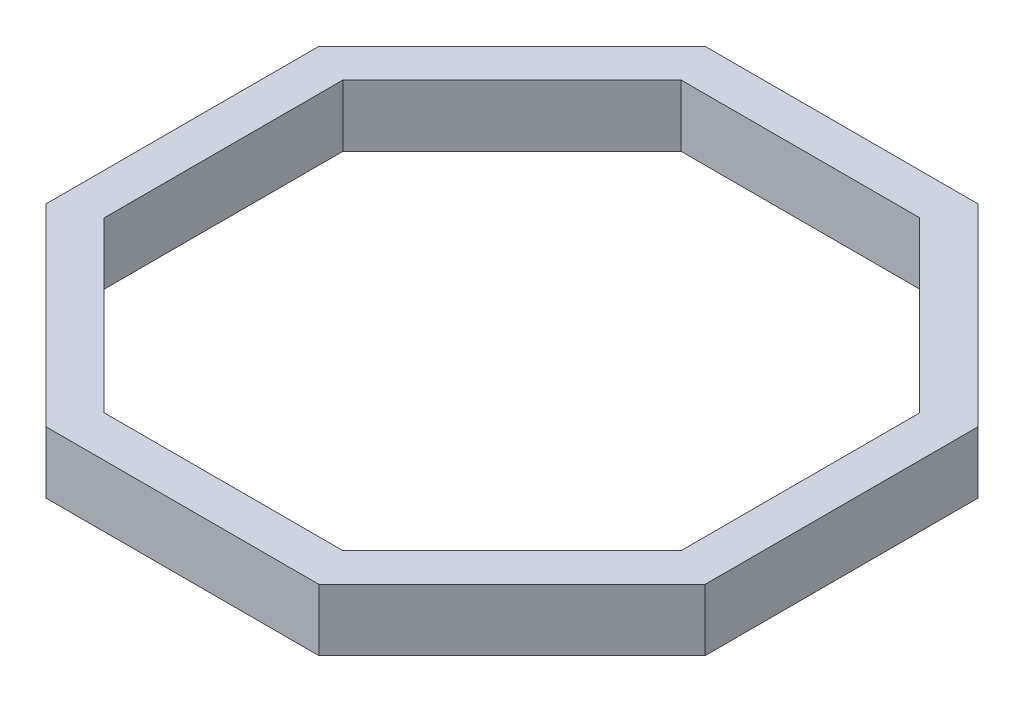
ISO-10303-21;
HEADER;
FILE_DESCRIPTION(('STEP AP214'),'2;1');
FILE_NAME('part.step','',(''),(''),'','','');
FILE_SCHEMA(('AUTOMOTIVE_DESIGN { 1 0 10303 214 1 1 1 1 }'));
ENDSEC;
DATA;
#1=APPLICATION_CONTEXT('core data for automotive mechanical design processes');
#2=APPLICATION_PROTOCOL_DEFINITION('international standard','automotive_design',2000,#1);
#3=PRODUCT_CONTEXT('',#1,'mechanical');
#4=PRODUCT('Part','Part','',(#3));
#5=PRODUCT_RELATED_PRODUCT_CATEGORY('part','',(#4));
#6=PRODUCT_DEFINITION_FORMATION('','',#4);
#7=PRODUCT_DEFINITION_CONTEXT('part definition',#1,'design');
#8=PRODUCT_DEFINITION('design','',#6,#7);
#9=PRODUCT_DEFINITION_SHAPE('','',#8);
#10=(LENGTH_UNIT() NAMED_UNIT(*) SI_UNIT(.MILLI.,.METRE.));
#11=(NAMED_UNIT(*) PLANE_ANGLE_UNIT() SI_UNIT($,.RADIAN.));
#12=(NAMED_UNIT(*) SI_UNIT($,.STERADIAN.) SOLID_ANGLE_UNIT());
#13=UNCERTAINTY_MEASURE_WITH_UNIT(LENGTH_MEASURE(1.E-05),#10,'distance_accuracy_value','');
#14=(GEOMETRIC_REPRESENTATION_CONTEXT(3) GLOBAL_UNCERTAINTY_ASSIGNED_CONTEXT((#13)) GLOBAL_UNIT_ASSIGNED_CONTEXT((#10,
#11,#12)) REPRESENTATION_CONTEXT('',''));
#15=CARTESIAN_POINT('',(0.,0.,0.));
#16=DIRECTION('',(0.,0.,1.));
#17=DIRECTION('',(1.,0.,0.));
#18=AXIS2_PLACEMENT_3D('',#15,#16,#17);
#19=CARTESIAN_POINT('',(160.,30.,66.274169979695));
#20=DIRECTION('',(-1.,0.,0.));
#21=DIRECTION('',(0.,0.,1.));
#22=AXIS2_PLACEMENT_3D('',#19,#20,#21);
#23=PLANE('',#22);
#24=DIRECTION('',(0.,0.,-1.));
#25=VECTOR('',#24,1.);
#26=CARTESIAN_POINT('',(160.,0.,66.274169979695));
#27=LINE('',#26,#25);
#28=CARTESIAN_POINT('',(160.,0.,66.274169979695));
#29=VERTEX_POINT('',#28);
#30=CARTESIAN_POINT('',(160.,0.,-66.2741699796952));
#31=VERTEX_POINT('',#30);
#32=EDGE_CURVE('E204',#29,#31,#27,.T.);
#33=ORIENTED_EDGE('',*,*,#32,.T.);
#34=DIRECTION('',(0.,-1.,0.));
#35=VECTOR('',#34,1.);
#36=CARTESIAN_POINT('',(160.,30.,-66.2741699796952));
#37=LINE('',#36,#35);
#38=CARTESIAN_POINT('',(160.,30.,-66.2741699796952));
#39=VERTEX_POINT('',#38);
#40=EDGE_CURVE('E11',#39,#31,#37,.T.);
#41=ORIENTED_EDGE('',*,*,#40,.F.);
#42=DIRECTION('',(0.,0.,-1.));
#43=VECTOR('',#42,1.);
#44=CARTESIAN_POINT('',(160.,30.,66.274169979695));
#45=LINE('',#44,#43);
#46=CARTESIAN_POINT('',(160.,30.,66.274169979695));
#47=VERTEX_POINT('',#46);
#48=EDGE_CURVE('E216',#47,#39,#45,.T.);
#49=ORIENTED_EDGE('',*,*,#48,.F.);
#50=DIRECTION('',(0.,-1.,0.));
#51=VECTOR('',#50,1.);
#52=CARTESIAN_POINT('',(160.,30.,66.274169979695));
#53=LINE('',#52,#51);
#54=EDGE_CURVE('E234',#47,#29,#53,.T.);
#55=ORIENTED_EDGE('',*,*,#54,.T.);
#56=EDGE_LOOP('',(#33,#41,#49,#55));
#57=FACE_BOUND('',#56,.T.);
#58=ADVANCED_FACE('F35',(#57),#23,.F.);
#59=CARTESIAN_POINT('',(160.,30.,-66.2741699796952));
#60=DIRECTION('',(-0.707106781186547,0.,0.707106781186548));
#61=DIRECTION('',(0.707106781186548,0.,0.707106781186547));
#62=AXIS2_PLACEMENT_3D('',#59,#60,#61);
#63=PLANE('',#62);
#64=DIRECTION('',(-0.707106781186548,0.,-0.707106781186547));
#65=VECTOR('',#64,1.);
#66=CARTESIAN_POINT('',(160.,0.,-66.2741699796952));
#67=LINE('',#66,#65);
#68=CARTESIAN_POINT('',(66.2741699796949,0.,-160.));
#69=VERTEX_POINT('',#68);
#70=EDGE_CURVE('E237',#31,#69,#67,.T.);
#71=ORIENTED_EDGE('',*,*,#70,.T.);
#72=DIRECTION('',(0.,-1.,0.));
#73=VECTOR('',#72,1.);
#74=CARTESIAN_POINT('',(66.2741699796949,30.,-160.));
#75=LINE('',#74,#73);
#76=CARTESIAN_POINT('',(66.2741699796949,30.,-160.));
#77=VERTEX_POINT('',#76);
#78=EDGE_CURVE('E42',#77,#69,#75,.T.);
#79=ORIENTED_EDGE('',*,*,#78,.F.);
#80=DIRECTION('',(-0.707106781186548,0.,-0.707106781186547));
#81=VECTOR('',#80,1.);
#82=CARTESIAN_POINT('',(160.,30.,-66.2741699796952));
#83=LINE('',#82,#81);
#84=EDGE_CURVE('E219',#39,#77,#83,.T.);
#85=ORIENTED_EDGE('',*,*,#84,.F.);
#86=ORIENTED_EDGE('',*,*,#40,.T.);
#87=EDGE_LOOP('',(#71,#79,#85,#86));
#88=FACE_BOUND('',#87,.T.);
#89=ADVANCED_FACE('F292',(#88),#63,.F.);
#90=CARTESIAN_POINT('',(66.2741699796949,30.,-160.));
#91=DIRECTION('',(0.,0.,1.));
#92=DIRECTION('',(1.,0.,0.));
#93=AXIS2_PLACEMENT_3D('',#90,#91,#92);
#94=PLANE('',#93);
#95=DIRECTION('',(-1.,0.,0.));
#96=VECTOR('',#95,1.);
#97=CARTESIAN_POINT('',(66.2741699796949,0.,-160.));
#98=LINE('',#97,#96);
#99=CARTESIAN_POINT('',(-66.2741699796952,0.,-160.));
#100=VERTEX_POINT('',#99);
#101=EDGE_CURVE('E239',#69,#100,#98,.T.);
#102=ORIENTED_EDGE('',*,*,#101,.T.);
#103=DIRECTION('',(0.,-1.,0.));
#104=VECTOR('',#103,1.);
#105=CARTESIAN_POINT('',(-66.2741699796952,30.,-160.));
#106=LINE('',#105,#104);
#107=CARTESIAN_POINT('',(-66.2741699796952,30.,-160.));
#108=VERTEX_POINT('',#107);
#109=EDGE_CURVE('E264',#108,#100,#106,.T.);
#110=ORIENTED_EDGE('',*,*,#109,.F.);
#111=DIRECTION('',(-1.,0.,0.));
#112=VECTOR('',#111,1.);
#113=CARTESIAN_POINT('',(66.2741699796949,30.,-160.));
#114=LINE('',#113,#112);
#115=EDGE_CURVE('E222',#77,#108,#114,.T.);
#116=ORIENTED_EDGE('',*,*,#115,.F.);
#117=ORIENTED_EDGE('',*,*,#78,.T.);
#118=EDGE_LOOP('',(#102,#110,#116,#117));
#119=FACE_BOUND('',#118,.T.);
#120=ADVANCED_FACE('F271',(#119),#94,.F.);
#121=CARTESIAN_POINT('',(-66.2741699796952,30.,-160.));
#122=DIRECTION('',(0.707106781186548,0.,0.707106781186547));
#123=DIRECTION('',(0.707106781186547,0.,-0.707106781186548));
#124=AXIS2_PLACEMENT_3D('',#121,#122,#123);
#125=PLANE('',#124);
#126=DIRECTION('',(-0.707106781186547,0.,0.707106781186548));
#127=VECTOR('',#126,1.);
#128=CARTESIAN_POINT('',(-66.2741699796952,0.,-160.));
#129=LINE('',#128,#127);
#130=CARTESIAN_POINT('',(-160.,0.,-66.274169979695));
#131=VERTEX_POINT('',#130);
#132=EDGE_CURVE('E241',#100,#131,#129,.T.);
#133=ORIENTED_EDGE('',*,*,#132,.T.);
#134=DIRECTION('',(0.,-1.,0.));
#135=VECTOR('',#134,1.);
#136=CARTESIAN_POINT('',(-160.,30.,-66.274169979695));
#137=LINE('',#136,#135);
#138=CARTESIAN_POINT('',(-160.,30.,-66.274169979695));
#139=VERTEX_POINT('',#138);
#140=EDGE_CURVE('E261',#139,#131,#137,.T.);
#141=ORIENTED_EDGE('',*,*,#140,.F.);
#142=DIRECTION('',(-0.707106781186547,0.,0.707106781186548));
#143=VECTOR('',#142,1.);
#144=CARTESIAN_POINT('',(-66.2741699796952,30.,-160.));
#145=LINE('',#144,#143);
#146=EDGE_CURVE('E224',#108,#139,#145,.T.);
#147=ORIENTED_EDGE('',*,*,#146,.F.);
#148=ORIENTED_EDGE('',*,*,#109,.T.);
#149=EDGE_LOOP('',(#133,#141,#147,#148));
#150=FACE_BOUND('',#149,.T.);
#151=ADVANCED_FACE('F280',(#150),#125,.F.);
#152=CARTESIAN_POINT('',(-160.,30.,-66.274169979695));
#153=DIRECTION('',(1.,0.,0.));
#154=DIRECTION('',(0.,0.,-1.));
#155=AXIS2_PLACEMENT_3D('',#152,#153,#154);
#156=PLANE('',#155);
#157=DIRECTION('',(0.,0.,1.));
#158=VECTOR('',#157,1.);
#159=CARTESIAN_POINT('',(-160.,0.,-66.274169979695));
#160=LINE('',#159,#158);
#161=CARTESIAN_POINT('',(-160.,0.,66.2741699796952));
#162=VERTEX_POINT('',#161);
#163=EDGE_CURVE('E243',#131,#162,#160,.T.);
#164=ORIENTED_EDGE('',*,*,#163,.T.);
#165=DIRECTION('',(0.,-1.,0.));
#166=VECTOR('',#165,1.);
#167=CARTESIAN_POINT('',(-160.,30.,66.2741699796952));
#168=LINE('',#167,#166);
#169=CARTESIAN_POINT('',(-160.,30.,66.2741699796952));
#170=VERTEX_POINT('',#169);
#171=EDGE_CURVE('E258',#170,#162,#168,.T.);
#172=ORIENTED_EDGE('',*,*,#171,.F.);
#173=DIRECTION('',(0.,0.,1.));
#174=VECTOR('',#173,1.);
#175=CARTESIAN_POINT('',(-160.,30.,-66.274169979695));
#176=LINE('',#175,#174);
#177=EDGE_CURVE('E226',#139,#170,#176,.T.);
#178=ORIENTED_EDGE('',*,*,#177,.F.);
#179=ORIENTED_EDGE('',*,*,#140,.T.);
#180=EDGE_LOOP('',(#164,#172,#178,#179));
#181=FACE_BOUND('',#180,.T.);
#182=ADVANCED_FACE('F284',(#181),#156,.F.);
#183=CARTESIAN_POINT('',(-160.,30.,66.2741699796952));
#184=DIRECTION('',(0.707106781186547,0.,-0.707106781186548));
#185=DIRECTION('',(-0.707106781186548,0.,-0.707106781186547));
#186=AXIS2_PLACEMENT_3D('',#183,#184,#185);
#187=PLANE('',#186);
#188=DIRECTION('',(0.707106781186548,0.,0.707106781186547));
#189=VECTOR('',#188,1.);
#190=CARTESIAN_POINT('',(-160.,0.,66.2741699796952));
#191=LINE('',#190,#189);
#192=CARTESIAN_POINT('',(-66.274169979695,0.,160.));
#193=VERTEX_POINT('',#192);
#194=EDGE_CURVE('E245',#162,#193,#191,.T.);
#195=ORIENTED_EDGE('',*,*,#194,.T.);
#196=DIRECTION('',(0.,-1.,0.));
#197=VECTOR('',#196,1.);
#198=CARTESIAN_POINT('',(-66.274169979695,30.,160.));
#199=LINE('',#198,#197);
#200=CARTESIAN_POINT('',(-66.274169979695,30.,160.));
#201=VERTEX_POINT('',#200);
#202=EDGE_CURVE('E255',#201,#193,#199,.T.);
#203=ORIENTED_EDGE('',*,*,#202,.F.);
#204=DIRECTION('',(0.707106781186548,0.,0.707106781186547));
#205=VECTOR('',#204,1.);
#206=CARTESIAN_POINT('',(-160.,30.,66.2741699796952));
#207=LINE('',#206,#205);
#208=EDGE_CURVE('E228',#170,#201,#207,.T.);
#209=ORIENTED_EDGE('',*,*,#208,.F.);
#210=ORIENTED_EDGE('',*,*,#171,.T.);
#211=EDGE_LOOP('',(#195,#203,#209,#210));
#212=FACE_BOUND('',#211,.T.);
#213=ADVANCED_FACE('F305',(#212),#187,.F.);
#214=CARTESIAN_POINT('',(-66.274169979695,30.,160.));
#215=DIRECTION('',(0.,0.,-1.));
#216=DIRECTION('',(-1.,0.,0.));
#217=AXIS2_PLACEMENT_3D('',#214,#215,#216);
#218=PLANE('',#217);
#219=DIRECTION('',(1.,0.,0.));
#220=VECTOR('',#219,1.);
#221=CARTESIAN_POINT('',(-66.274169979695,0.,160.));
#222=LINE('',#221,#220);
#223=CARTESIAN_POINT('',(66.2741699796951,0.,160.));
#224=VERTEX_POINT('',#223);
#225=EDGE_CURVE('E247',#193,#224,#222,.T.);
#226=ORIENTED_EDGE('',*,*,#225,.T.);
#227=DIRECTION('',(0.,-1.,0.));
#228=VECTOR('',#227,1.);
#229=CARTESIAN_POINT('',(66.2741699796951,30.,160.));
#230=LINE('',#229,#228);
#231=CARTESIAN_POINT('',(66.2741699796951,30.,160.));
#232=VERTEX_POINT('',#231);
#233=EDGE_CURVE('E252',#232,#224,#230,.T.);
#234=ORIENTED_EDGE('',*,*,#233,.F.);
#235=DIRECTION('',(1.,0.,0.));
#236=VECTOR('',#235,1.);
#237=CARTESIAN_POINT('',(-66.274169979695,30.,160.));
#238=LINE('',#237,#236);
#239=EDGE_CURVE('E230',#201,#232,#238,.T.);
#240=ORIENTED_EDGE('',*,*,#239,.F.);
#241=ORIENTED_EDGE('',*,*,#202,.T.);
#242=EDGE_LOOP('',(#226,#234,#240,#241));
#243=FACE_BOUND('',#242,.T.);
#244=ADVANCED_FACE('F303',(#243),#218,.F.);
#245=CARTESIAN_POINT('',(66.2741699796951,30.,160.));
#246=DIRECTION('',(-0.707106781186548,0.,-0.707106781186547));
#247=DIRECTION('',(-0.707106781186547,0.,0.707106781186548));
#248=AXIS2_PLACEMENT_3D('',#245,#246,#247);
#249=PLANE('',#248);
#250=DIRECTION('',(0.707106781186547,0.,-0.707106781186548));
#251=VECTOR('',#250,1.);
#252=CARTESIAN_POINT('',(66.2741699796951,0.,160.));
#253=LINE('',#252,#251);
#254=EDGE_CURVE('E220',#224,#29,#253,.T.);
#255=ORIENTED_EDGE('',*,*,#254,.T.);
#256=ORIENTED_EDGE('',*,*,#54,.F.);
#257=DIRECTION('',(0.707106781186547,0.,-0.707106781186548));
#258=VECTOR('',#257,1.);
#259=CARTESIAN_POINT('',(66.2741699796951,30.,160.));
#260=LINE('',#259,#258);
#261=EDGE_CURVE('E232',#232,#47,#260,.T.);
#262=ORIENTED_EDGE('',*,*,#261,.F.);
#263=ORIENTED_EDGE('',*,*,#233,.T.);
#264=EDGE_LOOP('',(#255,#256,#262,#263));
#265=FACE_BOUND('',#264,.T.);
#266=ADVANCED_FACE('F298',(#265),#249,.F.);
#267=CARTESIAN_POINT('',(0.,30.,0.));
#268=DIRECTION('',(0.,1.,0.));
#269=DIRECTION('',(0.,0.,1.));
#270=AXIS2_PLACEMENT_3D('',#267,#268,#269);
#271=PLANE('',#270);
#272=DIRECTION('',(0.,0.,-1.));
#273=VECTOR('',#272,1.);
#274=CARTESIAN_POINT('',(140.,30.,57.9898987322332));
#275=LINE('',#274,#273);
#276=CARTESIAN_POINT('',(140.,30.,57.9898987322332));
#277=VERTEX_POINT('',#276);
#278=CARTESIAN_POINT('',(140.,30.,-57.9898987322333));
#279=VERTEX_POINT('',#278);
#280=EDGE_CURVE('E49',#277,#279,#275,.T.);
#281=ORIENTED_EDGE('',*,*,#280,.F.);
#282=DIRECTION('',(0.707106781186547,0.,-0.707106781186548));
#283=VECTOR('',#282,1.);
#284=CARTESIAN_POINT('',(57.9898987322332,30.,140.));
#285=LINE('',#284,#283);
#286=CARTESIAN_POINT('',(57.9898987322332,30.,140.));
#287=VERTEX_POINT('',#286);
#288=EDGE_CURVE('E166',#287,#277,#285,.T.);
#289=ORIENTED_EDGE('',*,*,#288,.F.);
#290=DIRECTION('',(1.,0.,0.));
#291=VECTOR('',#290,1.);
#292=CARTESIAN_POINT('',(-57.9898987322332,30.,140.));
#293=LINE('',#292,#291);
#294=CARTESIAN_POINT('',(-57.9898987322332,30.,140.));
#295=VERTEX_POINT('',#294);
#296=EDGE_CURVE('E169',#295,#287,#293,.T.);
#297=ORIENTED_EDGE('',*,*,#296,.F.);
#298=DIRECTION('',(0.707106781186548,0.,0.707106781186547));
#299=VECTOR('',#298,1.);
#300=CARTESIAN_POINT('',(-140.,30.,57.9898987322333));
#301=LINE('',#300,#299);
#302=CARTESIAN_POINT('',(-140.,30.,57.9898987322333));
#303=VERTEX_POINT('',#302);
#304=EDGE_CURVE('E197',#303,#295,#301,.T.);
#305=ORIENTED_EDGE('',*,*,#304,.F.);
#306=DIRECTION('',(0.,0.,1.));
#307=VECTOR('',#306,1.);
#308=CARTESIAN_POINT('',(-140.,30.,-57.9898987322331));
#309=LINE('',#308,#307);
#310=CARTESIAN_POINT('',(-140.,30.,-57.9898987322331));
#311=VERTEX_POINT('',#310);
#312=EDGE_CURVE('E194',#311,#303,#309,.T.);
#313=ORIENTED_EDGE('',*,*,#312,.F.);
#314=DIRECTION('',(-0.707106781186547,0.,0.707106781186548));
#315=VECTOR('',#314,1.);
#316=CARTESIAN_POINT('',(-57.9898987322333,30.,-140.));
#317=LINE('',#316,#315);
#318=CARTESIAN_POINT('',(-57.9898987322333,30.,-140.));
#319=VERTEX_POINT('',#318);
#320=EDGE_CURVE('E191',#319,#311,#317,.T.);
#321=ORIENTED_EDGE('',*,*,#320,.F.);
#322=DIRECTION('',(-1.,0.,0.));
#323=VECTOR('',#322,1.);
#324=CARTESIAN_POINT('',(57.9898987322331,30.,-140.));
#325=LINE('',#324,#323);
#326=CARTESIAN_POINT('',(57.9898987322331,30.,-140.));
#327=VERTEX_POINT('',#326);
#328=EDGE_CURVE('E188',#327,#319,#325,.T.);
#329=ORIENTED_EDGE('',*,*,#328,.F.);
#330=DIRECTION('',(-0.707106781186548,0.,-0.707106781186547));
#331=VECTOR('',#330,1.);
#332=CARTESIAN_POINT('',(140.,30.,-57.9898987322333));
#333=LINE('',#332,#331);
#334=EDGE_CURVE('E186',#279,#327,#333,.T.);
#335=ORIENTED_EDGE('',*,*,#334,.F.);
#336=EDGE_LOOP('',(#281,#289,#297,#305,#313,#321,#329,#335));
#337=FACE_BOUND('',#336,.T.);
#338=ORIENTED_EDGE('',*,*,#48,.T.);
#339=ORIENTED_EDGE('',*,*,#84,.T.);
#340=ORIENTED_EDGE('',*,*,#115,.T.);
#341=ORIENTED_EDGE('',*,*,#146,.T.);
#342=ORIENTED_EDGE('',*,*,#177,.T.);
#343=ORIENTED_EDGE('',*,*,#208,.T.);
#344=ORIENTED_EDGE('',*,*,#239,.T.);
#345=ORIENTED_EDGE('',*,*,#261,.T.);
#346=EDGE_LOOP('',(#338,#339,#340,#341,#342,#343,#344,#345));
#347=FACE_BOUND('',#346,.T.);
#348=ADVANCED_FACE('F288',(#337,#347),#271,.T.);
#349=CARTESIAN_POINT('',(0.,0.,0.));
#350=DIRECTION('',(0.,1.,0.));
#351=DIRECTION('',(0.,0.,1.));
#352=AXIS2_PLACEMENT_3D('',#349,#350,#351);
#353=PLANE('',#352);
#354=DIRECTION('',(0.707106781186547,0.,-0.707106781186548));
#355=VECTOR('',#354,1.);
#356=CARTESIAN_POINT('',(57.9898987322332,0.,140.));
#357=LINE('',#356,#355);
#358=CARTESIAN_POINT('',(57.9898987322332,0.,140.));
#359=VERTEX_POINT('',#358);
#360=CARTESIAN_POINT('',(140.,0.,57.9898987322332));
#361=VERTEX_POINT('',#360);
#362=EDGE_CURVE('E155',#359,#361,#357,.T.);
#363=ORIENTED_EDGE('',*,*,#362,.T.);
#364=DIRECTION('',(0.,0.,-1.));
#365=VECTOR('',#364,1.);
#366=CARTESIAN_POINT('',(140.,0.,57.9898987322332));
#367=LINE('',#366,#365);
#368=CARTESIAN_POINT('',(140.,0.,-57.9898987322333));
#369=VERTEX_POINT('',#368);
#370=EDGE_CURVE('E149',#361,#369,#367,.T.);
#371=ORIENTED_EDGE('',*,*,#370,.T.);
#372=DIRECTION('',(-0.707106781186548,0.,-0.707106781186547));
#373=VECTOR('',#372,1.);
#374=CARTESIAN_POINT('',(140.,0.,-57.9898987322333));
#375=LINE('',#374,#373);
#376=CARTESIAN_POINT('',(57.9898987322331,0.,-140.));
#377=VERTEX_POINT('',#376);
#378=EDGE_CURVE('E158',#369,#377,#375,.T.);
#379=ORIENTED_EDGE('',*,*,#378,.T.);
#380=DIRECTION('',(-1.,0.,0.));
#381=VECTOR('',#380,1.);
#382=CARTESIAN_POINT('',(57.9898987322331,0.,-140.));
#383=LINE('',#382,#381);
#384=CARTESIAN_POINT('',(-57.9898987322333,0.,-140.));
#385=VERTEX_POINT('',#384);
#386=EDGE_CURVE('E57',#377,#385,#383,.T.);
#387=ORIENTED_EDGE('',*,*,#386,.T.);
#388=DIRECTION('',(-0.707106781186547,0.,0.707106781186548));
#389=VECTOR('',#388,1.);
#390=CARTESIAN_POINT('',(-57.9898987322333,0.,-140.));
#391=LINE('',#390,#389);
#392=CARTESIAN_POINT('',(-140.,0.,-57.9898987322331));
#393=VERTEX_POINT('',#392);
#394=EDGE_CURVE('E173',#385,#393,#391,.T.);
#395=ORIENTED_EDGE('',*,*,#394,.T.);
#396=DIRECTION('',(0.,0.,1.));
#397=VECTOR('',#396,1.);
#398=CARTESIAN_POINT('',(-140.,0.,-57.9898987322331));
#399=LINE('',#398,#397);
#400=CARTESIAN_POINT('',(-140.,0.,57.9898987322333));
#401=VERTEX_POINT('',#400);
#402=EDGE_CURVE('E176',#393,#401,#399,.T.);
#403=ORIENTED_EDGE('',*,*,#402,.T.);
#404=DIRECTION('',(0.707106781186548,0.,0.707106781186547));
#405=VECTOR('',#404,1.);
#406=CARTESIAN_POINT('',(-140.,0.,57.9898987322333));
#407=LINE('',#406,#405);
#408=CARTESIAN_POINT('',(-57.9898987322332,0.,140.));
#409=VERTEX_POINT('',#408);
#410=EDGE_CURVE('E179',#401,#409,#407,.T.);
#411=ORIENTED_EDGE('',*,*,#410,.T.);
#412=DIRECTION('',(1.,0.,0.));
#413=VECTOR('',#412,1.);
#414=CARTESIAN_POINT('',(-57.9898987322332,0.,140.));
#415=LINE('',#414,#413);
#416=EDGE_CURVE('E182',#409,#359,#415,.T.);
#417=ORIENTED_EDGE('',*,*,#416,.T.);
#418=EDGE_LOOP('',(#363,#371,#379,#387,#395,#403,#411,#417));
#419=FACE_BOUND('',#418,.T.);
#420=ORIENTED_EDGE('',*,*,#32,.F.);
#421=ORIENTED_EDGE('',*,*,#254,.F.);
#422=ORIENTED_EDGE('',*,*,#225,.F.);
#423=ORIENTED_EDGE('',*,*,#194,.F.);
#424=ORIENTED_EDGE('',*,*,#163,.F.);
#425=ORIENTED_EDGE('',*,*,#132,.F.);
#426=ORIENTED_EDGE('',*,*,#101,.F.);
#427=ORIENTED_EDGE('',*,*,#70,.F.);
#428=EDGE_LOOP('',(#420,#421,#422,#423,#424,#425,#426,#427));
#429=FACE_BOUND('',#428,.T.);
#430=ADVANCED_FACE('F162',(#419,#429),#353,.F.);
#431=CARTESIAN_POINT('',(140.,0.,57.9898987322332));
#432=DIRECTION('',(1.,0.,0.));
#433=DIRECTION('',(0.,0.,-1.));
#434=AXIS2_PLACEMENT_3D('',#431,#432,#433);
#435=PLANE('',#434);
#436=ORIENTED_EDGE('',*,*,#280,.T.);
#437=DIRECTION('',(0.,1.,0.));
#438=VECTOR('',#437,1.);
#439=CARTESIAN_POINT('',(140.,0.,-57.9898987322333));
#440=LINE('',#439,#438);
#441=EDGE_CURVE('E145',#369,#279,#440,.T.);
#442=ORIENTED_EDGE('',*,*,#441,.F.);
#443=ORIENTED_EDGE('',*,*,#370,.F.);
#444=DIRECTION('',(0.,1.,0.));
#445=VECTOR('',#444,1.);
#446=CARTESIAN_POINT('',(140.,0.,57.9898987322332));
#447=LINE('',#446,#445);
#448=EDGE_CURVE('E202',#361,#277,#447,.T.);
#449=ORIENTED_EDGE('',*,*,#448,.T.);
#450=EDGE_LOOP('',(#436,#442,#443,#449));
#451=FACE_BOUND('',#450,.T.);
#452=ADVANCED_FACE('F147',(#451),#435,.F.);
#453=CARTESIAN_POINT('',(57.9898987322332,0.,140.));
#454=DIRECTION('',(0.707106781186548,0.,0.707106781186547));
#455=DIRECTION('',(0.707106781186547,0.,-0.707106781186548));
#456=AXIS2_PLACEMENT_3D('',#453,#454,#455);
#457=PLANE('',#456);
#458=ORIENTED_EDGE('',*,*,#288,.T.);
#459=ORIENTED_EDGE('',*,*,#448,.F.);
#460=ORIENTED_EDGE('',*,*,#362,.F.);
#461=DIRECTION('',(0.,1.,0.));
#462=VECTOR('',#461,1.);
#463=CARTESIAN_POINT('',(57.9898987322332,0.,140.));
#464=LINE('',#463,#462);
#465=EDGE_CURVE('E205',#359,#287,#464,.T.);
#466=ORIENTED_EDGE('',*,*,#465,.T.);
#467=EDGE_LOOP('',(#458,#459,#460,#466));
#468=FACE_BOUND('',#467,.T.);
#469=ADVANCED_FACE('F376',(#468),#457,.F.);
#470=CARTESIAN_POINT('',(-57.9898987322332,0.,140.));
#471=DIRECTION('',(0.,0.,1.));
#472=DIRECTION('',(1.,0.,0.));
#473=AXIS2_PLACEMENT_3D('',#470,#471,#472);
#474=PLANE('',#473);
#475=ORIENTED_EDGE('',*,*,#296,.T.);
#476=ORIENTED_EDGE('',*,*,#465,.F.);
#477=ORIENTED_EDGE('',*,*,#416,.F.);
#478=DIRECTION('',(0.,1.,0.));
#479=VECTOR('',#478,1.);
#480=CARTESIAN_POINT('',(-57.9898987322332,0.,140.));
#481=LINE('',#480,#479);
#482=EDGE_CURVE('E207',#409,#295,#481,.T.);
#483=ORIENTED_EDGE('',*,*,#482,.T.);
#484=EDGE_LOOP('',(#475,#476,#477,#483));
#485=FACE_BOUND('',#484,.T.);
#486=ADVANCED_FACE('F385',(#485),#474,.F.);
#487=CARTESIAN_POINT('',(-140.,0.,57.9898987322333));
#488=DIRECTION('',(-0.707106781186547,0.,0.707106781186548));
#489=DIRECTION('',(0.707106781186548,0.,0.707106781186547));
#490=AXIS2_PLACEMENT_3D('',#487,#488,#489);
#491=PLANE('',#490);
#492=ORIENTED_EDGE('',*,*,#304,.T.);
#493=ORIENTED_EDGE('',*,*,#482,.F.);
#494=ORIENTED_EDGE('',*,*,#410,.F.);
#495=DIRECTION('',(0.,1.,0.));
#496=VECTOR('',#495,1.);
#497=CARTESIAN_POINT('',(-140.,0.,57.9898987322333));
#498=LINE('',#497,#496);
#499=EDGE_CURVE('E209',#401,#303,#498,.T.);
#500=ORIENTED_EDGE('',*,*,#499,.T.);
#501=EDGE_LOOP('',(#492,#493,#494,#500));
#502=FACE_BOUND('',#501,.T.);
#503=ADVANCED_FACE('F395',(#502),#491,.F.);
#504=CARTESIAN_POINT('',(-140.,0.,-57.9898987322331));
#505=DIRECTION('',(-1.,0.,0.));
#506=DIRECTION('',(0.,0.,1.));
#507=AXIS2_PLACEMENT_3D('',#504,#505,#506);
#508=PLANE('',#507);
#509=ORIENTED_EDGE('',*,*,#312,.T.);
#510=ORIENTED_EDGE('',*,*,#499,.F.);
#511=ORIENTED_EDGE('',*,*,#402,.F.);
#512=DIRECTION('',(0.,1.,0.));
#513=VECTOR('',#512,1.);
#514=CARTESIAN_POINT('',(-140.,0.,-57.9898987322331));
#515=LINE('',#514,#513);
#516=EDGE_CURVE('E211',#393,#311,#515,.T.);
#517=ORIENTED_EDGE('',*,*,#516,.T.);
#518=EDGE_LOOP('',(#509,#510,#511,#517));
#519=FACE_BOUND('',#518,.T.);
#520=ADVANCED_FACE('F405',(#519),#508,.F.);
#521=CARTESIAN_POINT('',(-57.9898987322333,0.,-140.));
#522=DIRECTION('',(-0.707106781186548,0.,-0.707106781186547));
#523=DIRECTION('',(-0.707106781186547,0.,0.707106781186548));
#524=AXIS2_PLACEMENT_3D('',#521,#522,#523);
#525=PLANE('',#524);
#526=ORIENTED_EDGE('',*,*,#320,.T.);
#527=ORIENTED_EDGE('',*,*,#516,.F.);
#528=ORIENTED_EDGE('',*,*,#394,.F.);
#529=DIRECTION('',(0.,1.,0.));
#530=VECTOR('',#529,1.);
#531=CARTESIAN_POINT('',(-57.9898987322333,0.,-140.));
#532=LINE('',#531,#530);
#533=EDGE_CURVE('E213',#385,#319,#532,.T.);
#534=ORIENTED_EDGE('',*,*,#533,.T.);
#535=EDGE_LOOP('',(#526,#527,#528,#534));
#536=FACE_BOUND('',#535,.T.);
#537=ADVANCED_FACE('F415',(#536),#525,.F.);
#538=CARTESIAN_POINT('',(57.9898987322331,0.,-140.));
#539=DIRECTION('',(0.,0.,-1.));
#540=DIRECTION('',(-1.,0.,0.));
#541=AXIS2_PLACEMENT_3D('',#538,#539,#540);
#542=PLANE('',#541);
#543=ORIENTED_EDGE('',*,*,#328,.T.);
#544=ORIENTED_EDGE('',*,*,#533,.F.);
#545=ORIENTED_EDGE('',*,*,#386,.F.);
#546=DIRECTION('',(0.,1.,0.));
#547=VECTOR('',#546,1.);
#548=CARTESIAN_POINT('',(57.9898987322331,0.,-140.));
#549=LINE('',#548,#547);
#550=EDGE_CURVE('E154',#377,#327,#549,.T.);
#551=ORIENTED_EDGE('',*,*,#550,.T.);
#552=EDGE_LOOP('',(#543,#544,#545,#551));
#553=FACE_BOUND('',#552,.T.);
#554=ADVANCED_FACE('F425',(#553),#542,.F.);
#555=CARTESIAN_POINT('',(140.,0.,-57.9898987322333));
#556=DIRECTION('',(0.707106781186547,0.,-0.707106781186548));
#557=DIRECTION('',(-0.707106781186548,0.,-0.707106781186547));
#558=AXIS2_PLACEMENT_3D('',#555,#556,#557);
#559=PLANE('',#558);
#560=ORIENTED_EDGE('',*,*,#334,.T.);
#561=ORIENTED_EDGE('',*,*,#550,.F.);
#562=ORIENTED_EDGE('',*,*,#378,.F.);
#563=ORIENTED_EDGE('',*,*,#441,.T.);
#564=EDGE_LOOP('',(#560,#561,#562,#563));
#565=FACE_BOUND('',#564,.T.);
#566=ADVANCED_FACE('F159',(#565),#559,.F.);
#567=CLOSED_SHELL('',(#58,#89,#120,#151,#182,#213,#244,#266,#348,#430,#452,#469,#486,#503,#520,
#537,#554,#566));
#568=MANIFOLD_SOLID_BREP('B2',#567);
#569=ADVANCED_BREP_SHAPE_REPRESENTATION('',(#18,#568),#14);
#570=SHAPE_DEFINITION_REPRESENTATION(#9,#569);
ENDSEC;
END-ISO-10303-21;
